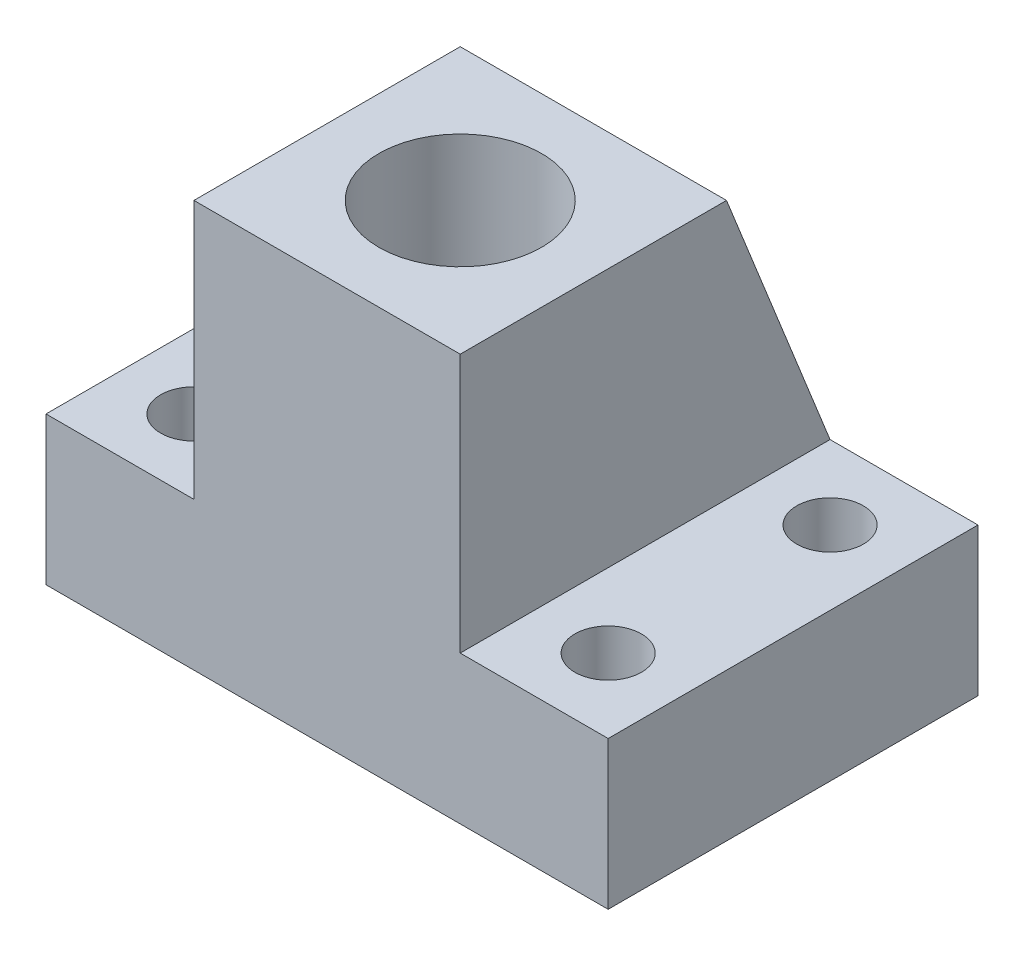
ISO-10303-21;
HEADER;
FILE_DESCRIPTION(('STEP AP214'),'2;1');
FILE_NAME('part.step','',(''),(''),'','','');
FILE_SCHEMA(('AUTOMOTIVE_DESIGN { 1 0 10303 214 1 1 1 1 }'));
ENDSEC;
DATA;
#1=APPLICATION_CONTEXT('core data for automotive mechanical design processes');
#2=APPLICATION_PROTOCOL_DEFINITION('international standard','automotive_design',2000,#1);
#3=PRODUCT_CONTEXT('',#1,'mechanical');
#4=PRODUCT('Part','Part','',(#3));
#5=PRODUCT_RELATED_PRODUCT_CATEGORY('part','',(#4));
#6=PRODUCT_DEFINITION_FORMATION('','',#4);
#7=PRODUCT_DEFINITION_CONTEXT('part definition',#1,'design');
#8=PRODUCT_DEFINITION('design','',#6,#7);
#9=PRODUCT_DEFINITION_SHAPE('','',#8);
#10=(LENGTH_UNIT() NAMED_UNIT(*) SI_UNIT(.MILLI.,.METRE.));
#11=(NAMED_UNIT(*) PLANE_ANGLE_UNIT() SI_UNIT($,.RADIAN.));
#12=(NAMED_UNIT(*) SI_UNIT($,.STERADIAN.) SOLID_ANGLE_UNIT());
#13=UNCERTAINTY_MEASURE_WITH_UNIT(LENGTH_MEASURE(1.E-05),#10,'distance_accuracy_value','');
#14=(GEOMETRIC_REPRESENTATION_CONTEXT(3) GLOBAL_UNCERTAINTY_ASSIGNED_CONTEXT((#13)) GLOBAL_UNIT_ASSIGNED_CONTEXT((#10,
#11,#12)) REPRESENTATION_CONTEXT('',''));
#15=CARTESIAN_POINT('',(0.,0.,0.));
#16=DIRECTION('',(0.,0.,1.));
#17=DIRECTION('',(1.,0.,0.));
#18=AXIS2_PLACEMENT_3D('',#15,#16,#17);
#19=CARTESIAN_POINT('',(38.,20.,-32.));
#20=DIRECTION('',(1.,0.,0.));
#21=DIRECTION('',(0.,0.,-1.));
#22=AXIS2_PLACEMENT_3D('',#19,#20,#21);
#23=PLANE('',#22);
#24=DIRECTION('',(0.,0.,1.));
#25=VECTOR('',#24,1.);
#26=CARTESIAN_POINT('',(38.,20.,-32.));
#27=LINE('',#26,#25);
#28=CARTESIAN_POINT('',(38.,20.,-32.));
#29=VERTEX_POINT('',#28);
#30=CARTESIAN_POINT('',(38.,20.,18.));
#31=VERTEX_POINT('',#30);
#32=EDGE_CURVE('E38',#29,#31,#27,.T.);
#33=ORIENTED_EDGE('',*,*,#32,.T.);
#34=DIRECTION('',(0.,1.,0.));
#35=VECTOR('',#34,1.);
#36=CARTESIAN_POINT('',(38.,20.,18.));
#37=LINE('',#36,#35);
#38=CARTESIAN_POINT('',(38.,0.,18.));
#39=VERTEX_POINT('',#38);
#40=EDGE_CURVE('E251',#39,#31,#37,.T.);
#41=ORIENTED_EDGE('',*,*,#40,.F.);
#42=DIRECTION('',(0.,0.,1.));
#43=VECTOR('',#42,1.);
#44=CARTESIAN_POINT('',(38.,0.,-32.));
#45=LINE('',#44,#43);
#46=CARTESIAN_POINT('',(38.,0.,-32.));
#47=VERTEX_POINT('',#46);
#48=EDGE_CURVE('E11',#47,#39,#45,.T.);
#49=ORIENTED_EDGE('',*,*,#48,.F.);
#50=DIRECTION('',(0.,1.,0.));
#51=VECTOR('',#50,1.);
#52=CARTESIAN_POINT('',(38.,20.,-32.));
#53=LINE('',#52,#51);
#54=EDGE_CURVE('E165',#47,#29,#53,.T.);
#55=ORIENTED_EDGE('',*,*,#54,.T.);
#56=EDGE_LOOP('',(#33,#41,#49,#55));
#57=FACE_BOUND('',#56,.T.);
#58=ADVANCED_FACE('F35',(#57),#23,.T.);
#59=CARTESIAN_POINT('',(38.,0.,-32.));
#60=DIRECTION('',(0.,-1.,0.));
#61=DIRECTION('',(1.,0.,0.));
#62=AXIS2_PLACEMENT_3D('',#59,#60,#61);
#63=PLANE('',#62);
#64=CARTESIAN_POINT('',(28.,0.,8.));
#65=DIRECTION('',(0.,-1.,0.));
#66=DIRECTION('',(1.,0.,0.));
#67=AXIS2_PLACEMENT_3D('',#64,#65,#66);
#68=CIRCLE('',#67,4.5);
#69=CARTESIAN_POINT('',(28.,0.,12.5));
#70=VERTEX_POINT('',#69);
#71=EDGE_CURVE('E223',#70,#70,#68,.F.);
#72=ORIENTED_EDGE('',*,*,#71,.T.);
#73=EDGE_LOOP('',(#72));
#74=FACE_BOUND('',#73,.T.);
#75=CARTESIAN_POINT('',(28.,0.,-22.));
#76=DIRECTION('',(0.,-1.,0.));
#77=DIRECTION('',(1.,0.,0.));
#78=AXIS2_PLACEMENT_3D('',#75,#76,#77);
#79=CIRCLE('',#78,4.50000000000017);
#80=CARTESIAN_POINT('',(28.,0.,-17.4999999999998));
#81=VERTEX_POINT('',#80);
#82=EDGE_CURVE('E215',#81,#81,#79,.F.);
#83=ORIENTED_EDGE('',*,*,#82,.T.);
#84=EDGE_LOOP('',(#83));
#85=FACE_BOUND('',#84,.T.);
#86=CARTESIAN_POINT('',(-28.,0.,8.));
#87=DIRECTION('',(0.,-1.,0.));
#88=DIRECTION('',(1.,0.,0.));
#89=AXIS2_PLACEMENT_3D('',#86,#87,#88);
#90=CIRCLE('',#89,4.5);
#91=CARTESIAN_POINT('',(-28.,0.,12.5));
#92=VERTEX_POINT('',#91);
#93=EDGE_CURVE('E214',#92,#92,#90,.F.);
#94=ORIENTED_EDGE('',*,*,#93,.T.);
#95=EDGE_LOOP('',(#94));
#96=FACE_BOUND('',#95,.T.);
#97=CARTESIAN_POINT('',(-28.,0.,-22.));
#98=DIRECTION('',(0.,-1.,0.));
#99=DIRECTION('',(1.,0.,0.));
#100=AXIS2_PLACEMENT_3D('',#97,#98,#99);
#101=CIRCLE('',#100,4.5);
#102=CARTESIAN_POINT('',(-28.,0.,-17.5));
#103=VERTEX_POINT('',#102);
#104=EDGE_CURVE('E227',#103,#103,#101,.F.);
#105=ORIENTED_EDGE('',*,*,#104,.T.);
#106=EDGE_LOOP('',(#105));
#107=FACE_BOUND('',#106,.T.);
#108=CARTESIAN_POINT('',(0.,0.,0.));
#109=DIRECTION('',(0.,-1.,0.));
#110=DIRECTION('',(1.,0.,0.));
#111=AXIS2_PLACEMENT_3D('',#108,#109,#110);
#112=CIRCLE('',#111,11.);
#113=CARTESIAN_POINT('',(11.,0.,0.));
#114=VERTEX_POINT('',#113);
#115=EDGE_CURVE('E239',#114,#114,#112,.T.);
#116=ORIENTED_EDGE('',*,*,#115,.F.);
#117=EDGE_LOOP('',(#116));
#118=FACE_BOUND('',#117,.T.);
#119=ORIENTED_EDGE('',*,*,#48,.T.);
#120=DIRECTION('',(1.,0.,0.));
#121=VECTOR('',#120,1.);
#122=CARTESIAN_POINT('',(38.,0.,18.));
#123=LINE('',#122,#121);
#124=CARTESIAN_POINT('',(-38.,0.,18.));
#125=VERTEX_POINT('',#124);
#126=EDGE_CURVE('E163',#125,#39,#123,.T.);
#127=ORIENTED_EDGE('',*,*,#126,.F.);
#128=DIRECTION('',(0.,0.,1.));
#129=VECTOR('',#128,1.);
#130=CARTESIAN_POINT('',(-38.,0.,-32.));
#131=LINE('',#130,#129);
#132=CARTESIAN_POINT('',(-38.,0.,-32.));
#133=VERTEX_POINT('',#132);
#134=EDGE_CURVE('E43',#133,#125,#131,.T.);
#135=ORIENTED_EDGE('',*,*,#134,.F.);
#136=DIRECTION('',(1.,0.,0.));
#137=VECTOR('',#136,1.);
#138=CARTESIAN_POINT('',(38.,0.,-32.));
#139=LINE('',#138,#137);
#140=EDGE_CURVE('E137',#133,#47,#139,.T.);
#141=ORIENTED_EDGE('',*,*,#140,.T.);
#142=EDGE_LOOP('',(#119,#127,#135,#141));
#143=FACE_BOUND('',#142,.T.);
#144=ADVANCED_FACE('F176',(#74,#85,#96,#107,#118,#143),#63,.T.);
#145=CARTESIAN_POINT('',(-38.,0.,-32.));
#146=DIRECTION('',(-1.,0.,0.));
#147=DIRECTION('',(0.,-1.,0.));
#148=AXIS2_PLACEMENT_3D('',#145,#146,#147);
#149=PLANE('',#148);
#150=ORIENTED_EDGE('',*,*,#134,.T.);
#151=DIRECTION('',(0.,-1.,0.));
#152=VECTOR('',#151,1.);
#153=CARTESIAN_POINT('',(-38.,0.,18.));
#154=LINE('',#153,#152);
#155=CARTESIAN_POINT('',(-38.,20.,18.));
#156=VERTEX_POINT('',#155);
#157=EDGE_CURVE('E160',#156,#125,#154,.T.);
#158=ORIENTED_EDGE('',*,*,#157,.F.);
#159=DIRECTION('',(0.,0.,1.));
#160=VECTOR('',#159,1.);
#161=CARTESIAN_POINT('',(-38.,20.,-32.));
#162=LINE('',#161,#160);
#163=CARTESIAN_POINT('',(-38.,20.,-32.));
#164=VERTEX_POINT('',#163);
#165=EDGE_CURVE('E127',#164,#156,#162,.T.);
#166=ORIENTED_EDGE('',*,*,#165,.F.);
#167=DIRECTION('',(0.,-1.,0.));
#168=VECTOR('',#167,1.);
#169=CARTESIAN_POINT('',(-38.,0.,-32.));
#170=LINE('',#169,#168);
#171=EDGE_CURVE('E138',#164,#133,#170,.T.);
#172=ORIENTED_EDGE('',*,*,#171,.T.);
#173=EDGE_LOOP('',(#150,#158,#166,#172));
#174=FACE_BOUND('',#173,.T.);
#175=ADVANCED_FACE('F162',(#174),#149,.T.);
#176=CARTESIAN_POINT('',(-38.,20.,-32.));
#177=DIRECTION('',(0.,1.,0.));
#178=DIRECTION('',(0.,0.,1.));
#179=AXIS2_PLACEMENT_3D('',#176,#177,#178);
#180=PLANE('',#179);
#181=CARTESIAN_POINT('',(-28.,20.,8.));
#182=DIRECTION('',(0.,1.,0.));
#183=DIRECTION('',(0.,0.,1.));
#184=AXIS2_PLACEMENT_3D('',#181,#182,#183);
#185=CIRCLE('',#184,4.5);
#186=CARTESIAN_POINT('',(-28.,20.,12.5));
#187=VERTEX_POINT('',#186);
#188=EDGE_CURVE('E218',#187,#187,#185,.T.);
#189=ORIENTED_EDGE('',*,*,#188,.F.);
#190=EDGE_LOOP('',(#189));
#191=FACE_BOUND('',#190,.T.);
#192=CARTESIAN_POINT('',(-28.,20.,-22.));
#193=DIRECTION('',(0.,1.,0.));
#194=DIRECTION('',(0.,0.,1.));
#195=AXIS2_PLACEMENT_3D('',#192,#193,#194);
#196=CIRCLE('',#195,4.5);
#197=CARTESIAN_POINT('',(-28.,20.,-17.5));
#198=VERTEX_POINT('',#197);
#199=EDGE_CURVE('E229',#198,#198,#196,.T.);
#200=ORIENTED_EDGE('',*,*,#199,.F.);
#201=EDGE_LOOP('',(#200));
#202=FACE_BOUND('',#201,.T.);
#203=ORIENTED_EDGE('',*,*,#165,.T.);
#204=DIRECTION('',(-1.,0.,0.));
#205=VECTOR('',#204,1.);
#206=CARTESIAN_POINT('',(-38.,20.,18.));
#207=LINE('',#206,#205);
#208=CARTESIAN_POINT('',(-18.,20.,18.));
#209=VERTEX_POINT('',#208);
#210=EDGE_CURVE('E150',#209,#156,#207,.T.);
#211=ORIENTED_EDGE('',*,*,#210,.F.);
#212=DIRECTION('',(0.,0.,1.));
#213=VECTOR('',#212,1.);
#214=CARTESIAN_POINT('',(-18.,20.,-32.));
#215=LINE('',#214,#213);
#216=CARTESIAN_POINT('',(-18.,20.,-32.));
#217=VERTEX_POINT('',#216);
#218=EDGE_CURVE('E125',#217,#209,#215,.T.);
#219=ORIENTED_EDGE('',*,*,#218,.F.);
#220=DIRECTION('',(-1.,0.,0.));
#221=VECTOR('',#220,1.);
#222=CARTESIAN_POINT('',(-38.,20.,-32.));
#223=LINE('',#222,#221);
#224=EDGE_CURVE('E141',#217,#164,#223,.T.);
#225=ORIENTED_EDGE('',*,*,#224,.T.);
#226=EDGE_LOOP('',(#203,#211,#219,#225));
#227=FACE_BOUND('',#226,.T.);
#228=ADVANCED_FACE('F149',(#191,#202,#227),#180,.T.);
#229=CARTESIAN_POINT('',(-18.,20.,-32.));
#230=DIRECTION('',(-1.,0.,0.));
#231=DIRECTION('',(0.,0.,1.));
#232=AXIS2_PLACEMENT_3D('',#229,#230,#231);
#233=PLANE('',#232);
#234=DIRECTION('',(0.,-0.928476690885259,-0.371390676354104));
#235=VECTOR('',#234,1.);
#236=CARTESIAN_POINT('',(-18.,55.,-18.));
#237=LINE('',#236,#235);
#238=CARTESIAN_POINT('',(-18.,55.,-18.));
#239=VERTEX_POINT('',#238);
#240=EDGE_CURVE('E99',#239,#217,#237,.T.);
#241=ORIENTED_EDGE('',*,*,#240,.T.);
#242=ORIENTED_EDGE('',*,*,#218,.T.);
#243=DIRECTION('',(0.,-1.,0.));
#244=VECTOR('',#243,1.);
#245=CARTESIAN_POINT('',(-18.,20.,18.));
#246=LINE('',#245,#244);
#247=CARTESIAN_POINT('',(-18.,55.,18.));
#248=VERTEX_POINT('',#247);
#249=EDGE_CURVE('E124',#248,#209,#246,.T.);
#250=ORIENTED_EDGE('',*,*,#249,.F.);
#251=DIRECTION('',(0.,0.,1.));
#252=VECTOR('',#251,1.);
#253=CARTESIAN_POINT('',(-18.,55.,-32.));
#254=LINE('',#253,#252);
#255=EDGE_CURVE('E116',#239,#248,#254,.T.);
#256=ORIENTED_EDGE('',*,*,#255,.F.);
#257=EDGE_LOOP('',(#241,#242,#250,#256));
#258=FACE_BOUND('',#257,.T.);
#259=ADVANCED_FACE('F122',(#258),#233,.T.);
#260=CARTESIAN_POINT('',(-18.,55.,-32.));
#261=DIRECTION('',(0.,1.,0.));
#262=DIRECTION('',(0.,0.,1.));
#263=AXIS2_PLACEMENT_3D('',#260,#261,#262);
#264=PLANE('',#263);
#265=DIRECTION('',(1.,0.,0.));
#266=VECTOR('',#265,1.);
#267=CARTESIAN_POINT('',(-38.001,55.,-18.));
#268=LINE('',#267,#266);
#269=CARTESIAN_POINT('',(18.,55.,-18.));
#270=VERTEX_POINT('',#269);
#271=EDGE_CURVE('E102',#239,#270,#268,.T.);
#272=ORIENTED_EDGE('',*,*,#271,.F.);
#273=ORIENTED_EDGE('',*,*,#255,.T.);
#274=DIRECTION('',(-1.,0.,0.));
#275=VECTOR('',#274,1.);
#276=CARTESIAN_POINT('',(-18.,55.,18.));
#277=LINE('',#276,#275);
#278=CARTESIAN_POINT('',(18.,55.,18.));
#279=VERTEX_POINT('',#278);
#280=EDGE_CURVE('E260',#279,#248,#277,.T.);
#281=ORIENTED_EDGE('',*,*,#280,.F.);
#282=DIRECTION('',(0.,0.,1.));
#283=VECTOR('',#282,1.);
#284=CARTESIAN_POINT('',(18.,55.,-32.));
#285=LINE('',#284,#283);
#286=EDGE_CURVE('E118',#270,#279,#285,.T.);
#287=ORIENTED_EDGE('',*,*,#286,.F.);
#288=EDGE_LOOP('',(#272,#273,#281,#287));
#289=FACE_BOUND('',#288,.T.);
#290=CARTESIAN_POINT('',(0.,55.,0.));
#291=DIRECTION('',(0.,1.,0.));
#292=DIRECTION('',(0.,0.,1.));
#293=AXIS2_PLACEMENT_3D('',#290,#291,#292);
#294=CIRCLE('',#293,11.);
#295=CARTESIAN_POINT('',(0.,55.,11.));
#296=VERTEX_POINT('',#295);
#297=EDGE_CURVE('E245',#296,#296,#294,.T.);
#298=ORIENTED_EDGE('',*,*,#297,.F.);
#299=EDGE_LOOP('',(#298));
#300=FACE_BOUND('',#299,.T.);
#301=ADVANCED_FACE('F113',(#289,#300),#264,.T.);
#302=CARTESIAN_POINT('',(18.,55.,-32.));
#303=DIRECTION('',(1.,0.,0.));
#304=DIRECTION('',(0.,1.,0.));
#305=AXIS2_PLACEMENT_3D('',#302,#303,#304);
#306=PLANE('',#305);
#307=DIRECTION('',(0.,-0.928476690885259,-0.371390676354104));
#308=VECTOR('',#307,1.);
#309=CARTESIAN_POINT('',(18.,55.,-18.));
#310=LINE('',#309,#308);
#311=CARTESIAN_POINT('',(18.,20.,-32.));
#312=VERTEX_POINT('',#311);
#313=EDGE_CURVE('E119',#270,#312,#310,.T.);
#314=ORIENTED_EDGE('',*,*,#313,.F.);
#315=ORIENTED_EDGE('',*,*,#286,.T.);
#316=DIRECTION('',(0.,1.,0.));
#317=VECTOR('',#316,1.);
#318=CARTESIAN_POINT('',(18.,55.,18.));
#319=LINE('',#318,#317);
#320=CARTESIAN_POINT('',(18.,20.,18.));
#321=VERTEX_POINT('',#320);
#322=EDGE_CURVE('E257',#321,#279,#319,.T.);
#323=ORIENTED_EDGE('',*,*,#322,.F.);
#324=DIRECTION('',(0.,0.,1.));
#325=VECTOR('',#324,1.);
#326=CARTESIAN_POINT('',(18.,20.,-32.));
#327=LINE('',#326,#325);
#328=EDGE_CURVE('E129',#312,#321,#327,.T.);
#329=ORIENTED_EDGE('',*,*,#328,.F.);
#330=EDGE_LOOP('',(#314,#315,#323,#329));
#331=FACE_BOUND('',#330,.T.);
#332=ADVANCED_FACE('F198',(#331),#306,.T.);
#333=CARTESIAN_POINT('',(18.,20.,-32.));
#334=DIRECTION('',(0.,1.,0.));
#335=DIRECTION('',(0.,0.,1.));
#336=AXIS2_PLACEMENT_3D('',#333,#334,#335);
#337=PLANE('',#336);
#338=CARTESIAN_POINT('',(28.,20.,8.));
#339=DIRECTION('',(0.,1.,0.));
#340=DIRECTION('',(0.,0.,1.));
#341=AXIS2_PLACEMENT_3D('',#338,#339,#340);
#342=CIRCLE('',#341,4.5);
#343=CARTESIAN_POINT('',(28.,20.,12.5));
#344=VERTEX_POINT('',#343);
#345=EDGE_CURVE('E209',#344,#344,#342,.T.);
#346=ORIENTED_EDGE('',*,*,#345,.F.);
#347=EDGE_LOOP('',(#346));
#348=FACE_BOUND('',#347,.T.);
#349=CARTESIAN_POINT('',(28.,20.,-22.));
#350=DIRECTION('',(0.,1.,0.));
#351=DIRECTION('',(0.,0.,1.));
#352=AXIS2_PLACEMENT_3D('',#349,#350,#351);
#353=CIRCLE('',#352,4.50000000000017);
#354=CARTESIAN_POINT('',(28.,20.,-17.4999999999998));
#355=VERTEX_POINT('',#354);
#356=EDGE_CURVE('E212',#355,#355,#353,.T.);
#357=ORIENTED_EDGE('',*,*,#356,.F.);
#358=EDGE_LOOP('',(#357));
#359=FACE_BOUND('',#358,.T.);
#360=ORIENTED_EDGE('',*,*,#328,.T.);
#361=DIRECTION('',(-1.,0.,0.));
#362=VECTOR('',#361,1.);
#363=CARTESIAN_POINT('',(18.,20.,18.));
#364=LINE('',#363,#362);
#365=EDGE_CURVE('E255',#31,#321,#364,.T.);
#366=ORIENTED_EDGE('',*,*,#365,.F.);
#367=ORIENTED_EDGE('',*,*,#32,.F.);
#368=DIRECTION('',(-1.,0.,0.));
#369=VECTOR('',#368,1.);
#370=CARTESIAN_POINT('',(18.,20.,-32.));
#371=LINE('',#370,#369);
#372=EDGE_CURVE('E170',#29,#312,#371,.T.);
#373=ORIENTED_EDGE('',*,*,#372,.T.);
#374=EDGE_LOOP('',(#360,#366,#367,#373));
#375=FACE_BOUND('',#374,.T.);
#376=ADVANCED_FACE('F172',(#348,#359,#375),#337,.T.);
#377=CARTESIAN_POINT('',(0.,0.,-32.));
#378=DIRECTION('',(0.,0.,-1.));
#379=DIRECTION('',(-1.,0.,0.));
#380=AXIS2_PLACEMENT_3D('',#377,#378,#379);
#381=PLANE('',#380);
#382=DIRECTION('',(1.,0.,0.));
#383=VECTOR('',#382,1.);
#384=CARTESIAN_POINT('',(-38.001,20.,-32.));
#385=LINE('',#384,#383);
#386=EDGE_CURVE('E105',#217,#312,#385,.T.);
#387=ORIENTED_EDGE('',*,*,#386,.T.);
#388=ORIENTED_EDGE('',*,*,#372,.F.);
#389=ORIENTED_EDGE('',*,*,#54,.F.);
#390=ORIENTED_EDGE('',*,*,#140,.F.);
#391=ORIENTED_EDGE('',*,*,#171,.F.);
#392=ORIENTED_EDGE('',*,*,#224,.F.);
#393=EDGE_LOOP('',(#387,#388,#389,#390,#391,#392));
#394=FACE_BOUND('',#393,.T.);
#395=ADVANCED_FACE('F174',(#394),#381,.T.);
#396=CARTESIAN_POINT('',(0.,0.,18.));
#397=DIRECTION('',(0.,0.,-1.));
#398=DIRECTION('',(-1.,0.,0.));
#399=AXIS2_PLACEMENT_3D('',#396,#397,#398);
#400=PLANE('',#399);
#401=ORIENTED_EDGE('',*,*,#40,.T.);
#402=ORIENTED_EDGE('',*,*,#365,.T.);
#403=ORIENTED_EDGE('',*,*,#322,.T.);
#404=ORIENTED_EDGE('',*,*,#280,.T.);
#405=ORIENTED_EDGE('',*,*,#249,.T.);
#406=ORIENTED_EDGE('',*,*,#210,.T.);
#407=ORIENTED_EDGE('',*,*,#157,.T.);
#408=ORIENTED_EDGE('',*,*,#126,.T.);
#409=EDGE_LOOP('',(#401,#402,#403,#404,#405,#406,#407,#408));
#410=FACE_BOUND('',#409,.T.);
#411=ADVANCED_FACE('F158',(#410),#400,.F.);
#412=CARTESIAN_POINT('',(0.,25.,0.));
#413=DIRECTION('',(0.,1.,0.));
#414=DIRECTION('',(0.,0.,1.));
#415=AXIS2_PLACEMENT_3D('',#412,#413,#414);
#416=CYLINDRICAL_SURFACE('',#415,11.);
#417=CARTESIAN_POINT('',(0.,25.,0.));
#418=DIRECTION('',(0.,1.,0.));
#419=DIRECTION('',(0.,0.,1.));
#420=AXIS2_PLACEMENT_3D('',#417,#418,#419);
#421=CIRCLE('',#420,11.);
#422=CARTESIAN_POINT('',(0.,25.,11.));
#423=VERTEX_POINT('',#422);
#424=EDGE_CURVE('E248',#423,#423,#421,.T.);
#425=ORIENTED_EDGE('',*,*,#424,.F.);
#426=EDGE_LOOP('',(#425));
#427=FACE_BOUND('',#426,.T.);
#428=ORIENTED_EDGE('',*,*,#297,.T.);
#429=EDGE_LOOP('',(#428));
#430=FACE_BOUND('',#429,.T.);
#431=ADVANCED_FACE('F264',(#427,#430),#416,.F.);
#432=CARTESIAN_POINT('',(0.,25.,0.));
#433=DIRECTION('',(0.,1.,0.));
#434=DIRECTION('',(0.,0.,1.));
#435=AXIS2_PLACEMENT_3D('',#432,#433,#434);
#436=PLANE('',#435);
#437=CARTESIAN_POINT('',(0.,25.,0.));
#438=DIRECTION('',(0.,1.,0.));
#439=DIRECTION('',(0.,0.,1.));
#440=AXIS2_PLACEMENT_3D('',#437,#438,#439);
#441=CIRCLE('',#440,5.5);
#442=CARTESIAN_POINT('',(0.,25.,5.5));
#443=VERTEX_POINT('',#442);
#444=EDGE_CURVE('E236',#443,#443,#441,.T.);
#445=ORIENTED_EDGE('',*,*,#444,.F.);
#446=EDGE_LOOP('',(#445));
#447=FACE_BOUND('',#446,.T.);
#448=ORIENTED_EDGE('',*,*,#424,.T.);
#449=EDGE_LOOP('',(#448));
#450=FACE_BOUND('',#449,.T.);
#451=ADVANCED_FACE('F266',(#447,#450),#436,.T.);
#452=CARTESIAN_POINT('',(0.,16.,0.));
#453=DIRECTION('',(0.,-1.,0.));
#454=DIRECTION('',(1.,0.,0.));
#455=AXIS2_PLACEMENT_3D('',#452,#453,#454);
#456=CYLINDRICAL_SURFACE('',#455,11.);
#457=CARTESIAN_POINT('',(0.,16.,0.));
#458=DIRECTION('',(0.,-1.,0.));
#459=DIRECTION('',(1.,0.,0.));
#460=AXIS2_PLACEMENT_3D('',#457,#458,#459);
#461=CIRCLE('',#460,11.);
#462=CARTESIAN_POINT('',(11.,16.,0.));
#463=VERTEX_POINT('',#462);
#464=EDGE_CURVE('E242',#463,#463,#461,.T.);
#465=ORIENTED_EDGE('',*,*,#464,.F.);
#466=EDGE_LOOP('',(#465));
#467=FACE_BOUND('',#466,.T.);
#468=ORIENTED_EDGE('',*,*,#115,.T.);
#469=EDGE_LOOP('',(#468));
#470=FACE_BOUND('',#469,.T.);
#471=ADVANCED_FACE('F273',(#467,#470),#456,.F.);
#472=CARTESIAN_POINT('',(0.,16.,0.));
#473=DIRECTION('',(0.,-1.,0.));
#474=DIRECTION('',(1.,0.,0.));
#475=AXIS2_PLACEMENT_3D('',#472,#473,#474);
#476=PLANE('',#475);
#477=CARTESIAN_POINT('',(0.,16.,0.));
#478=DIRECTION('',(0.,-1.,0.));
#479=DIRECTION('',(1.,0.,0.));
#480=AXIS2_PLACEMENT_3D('',#477,#478,#479);
#481=CIRCLE('',#480,5.5);
#482=CARTESIAN_POINT('',(5.5,16.,0.));
#483=VERTEX_POINT('',#482);
#484=EDGE_CURVE('E109',#483,#483,#481,.F.);
#485=ORIENTED_EDGE('',*,*,#484,.T.);
#486=EDGE_LOOP('',(#485));
#487=FACE_BOUND('',#486,.T.);
#488=ORIENTED_EDGE('',*,*,#464,.T.);
#489=EDGE_LOOP('',(#488));
#490=FACE_BOUND('',#489,.T.);
#491=ADVANCED_FACE('F280',(#487,#490),#476,.T.);
#492=CARTESIAN_POINT('',(0.,-0.00100000000000794,0.));
#493=DIRECTION('',(0.,1.,0.));
#494=DIRECTION('',(0.,0.,1.));
#495=AXIS2_PLACEMENT_3D('',#492,#493,#494);
#496=CYLINDRICAL_SURFACE('',#495,5.5);
#497=ORIENTED_EDGE('',*,*,#484,.F.);
#498=EDGE_LOOP('',(#497));
#499=FACE_BOUND('',#498,.T.);
#500=ORIENTED_EDGE('',*,*,#444,.T.);
#501=EDGE_LOOP('',(#500));
#502=FACE_BOUND('',#501,.T.);
#503=ADVANCED_FACE('F284',(#499,#502),#496,.F.);
#504=CARTESIAN_POINT('',(-38.001,55.,-18.));
#505=DIRECTION('',(0.,-0.371390676354104,0.928476690885259));
#506=DIRECTION('',(0.,-0.928476690885259,-0.371390676354104));
#507=AXIS2_PLACEMENT_3D('',#504,#505,#506);
#508=PLANE('',#507);
#509=ORIENTED_EDGE('',*,*,#271,.T.);
#510=ORIENTED_EDGE('',*,*,#313,.T.);
#511=ORIENTED_EDGE('',*,*,#386,.F.);
#512=ORIENTED_EDGE('',*,*,#240,.F.);
#513=EDGE_LOOP('',(#509,#510,#511,#512));
#514=FACE_BOUND('',#513,.T.);
#515=ADVANCED_FACE('F101',(#514),#508,.F.);
#516=CARTESIAN_POINT('',(-28.,-0.00100000000000794,-22.));
#517=DIRECTION('',(0.,1.,0.));
#518=DIRECTION('',(0.,0.,1.));
#519=AXIS2_PLACEMENT_3D('',#516,#517,#518);
#520=CYLINDRICAL_SURFACE('',#519,4.5);
#521=CARTESIAN_POINT('',(-28.,0.,-17.5));
#522=CARTESIAN_POINT('',(-28.,0.208333333333326,-17.5));
#523=CARTESIAN_POINT('',(-28.,0.416666666666659,-17.5));
#524=CARTESIAN_POINT('',(-28.,0.833333333333325,-17.5));
#525=CARTESIAN_POINT('',(-28.,1.04166666666666,-17.5));
#526=CARTESIAN_POINT('',(-28.,1.45833333333333,-17.5));
#527=CARTESIAN_POINT('',(-28.,1.66666666666666,-17.5));
#528=CARTESIAN_POINT('',(-28.,2.08333333333333,-17.5));
#529=CARTESIAN_POINT('',(-28.,2.29166666666666,-17.5));
#530=CARTESIAN_POINT('',(-28.,2.70833333333333,-17.5));
#531=CARTESIAN_POINT('',(-28.,2.91666666666666,-17.5));
#532=CARTESIAN_POINT('',(-28.,3.33333333333333,-17.5));
#533=CARTESIAN_POINT('',(-28.,3.54166666666666,-17.5));
#534=CARTESIAN_POINT('',(-28.,3.95833333333333,-17.5));
#535=CARTESIAN_POINT('',(-28.,4.16666666666666,-17.5));
#536=CARTESIAN_POINT('',(-28.,4.58333333333333,-17.5));
#537=CARTESIAN_POINT('',(-28.,4.79166666666666,-17.5));
#538=CARTESIAN_POINT('',(-28.,5.20833333333333,-17.5));
#539=CARTESIAN_POINT('',(-28.,5.41666666666666,-17.5));
#540=CARTESIAN_POINT('',(-28.,5.83333333333333,-17.5));
#541=CARTESIAN_POINT('',(-28.,6.04166666666666,-17.5));
#542=CARTESIAN_POINT('',(-28.,6.45833333333333,-17.5));
#543=CARTESIAN_POINT('',(-28.,6.66666666666666,-17.5));
#544=CARTESIAN_POINT('',(-28.,7.08333333333333,-17.5));
#545=CARTESIAN_POINT('',(-28.,7.29166666666666,-17.5));
#546=CARTESIAN_POINT('',(-28.,7.70833333333333,-17.5));
#547=CARTESIAN_POINT('',(-28.,7.91666666666666,-17.5));
#548=CARTESIAN_POINT('',(-28.,8.33333333333333,-17.5));
#549=CARTESIAN_POINT('',(-28.,8.54166666666666,-17.5));
#550=CARTESIAN_POINT('',(-28.,8.95833333333332,-17.5));
#551=CARTESIAN_POINT('',(-28.,9.16666666666666,-17.5));
#552=CARTESIAN_POINT('',(-28.,9.58333333333332,-17.5));
#553=CARTESIAN_POINT('',(-28.,9.79166666666666,-17.5));
#554=CARTESIAN_POINT('',(-28.,10.2083333333333,-17.5));
#555=CARTESIAN_POINT('',(-28.,10.4166666666667,-17.5));
#556=CARTESIAN_POINT('',(-28.,10.8333333333333,-17.5));
#557=CARTESIAN_POINT('',(-28.,11.0416666666667,-17.5));
#558=CARTESIAN_POINT('',(-28.,11.4583333333333,-17.5));
#559=CARTESIAN_POINT('',(-28.,11.6666666666667,-17.5));
#560=CARTESIAN_POINT('',(-28.,12.0833333333333,-17.5));
#561=CARTESIAN_POINT('',(-28.,12.2916666666667,-17.5));
#562=CARTESIAN_POINT('',(-28.,12.7083333333333,-17.5));
#563=CARTESIAN_POINT('',(-28.,12.9166666666667,-17.5));
#564=CARTESIAN_POINT('',(-28.,13.3333333333333,-17.5));
#565=CARTESIAN_POINT('',(-28.,13.5416666666667,-17.5));
#566=CARTESIAN_POINT('',(-28.,13.9583333333333,-17.5));
#567=CARTESIAN_POINT('',(-28.,14.1666666666667,-17.5));
#568=CARTESIAN_POINT('',(-28.,14.5833333333333,-17.5));
#569=CARTESIAN_POINT('',(-28.,14.7916666666667,-17.5));
#570=CARTESIAN_POINT('',(-28.,15.2083333333333,-17.5));
#571=CARTESIAN_POINT('',(-28.,15.4166666666667,-17.5));
#572=CARTESIAN_POINT('',(-28.,15.8333333333333,-17.5));
#573=CARTESIAN_POINT('',(-28.,16.0416666666667,-17.5));
#574=CARTESIAN_POINT('',(-28.,16.4583333333333,-17.5));
#575=CARTESIAN_POINT('',(-28.,16.6666666666667,-17.5));
#576=CARTESIAN_POINT('',(-28.,17.0833333333333,-17.5));
#577=CARTESIAN_POINT('',(-28.,17.2916666666667,-17.5));
#578=CARTESIAN_POINT('',(-28.,17.7083333333333,-17.5));
#579=CARTESIAN_POINT('',(-28.,17.9166666666667,-17.5));
#580=CARTESIAN_POINT('',(-28.,18.3333333333333,-17.5));
#581=CARTESIAN_POINT('',(-28.,18.5416666666667,-17.5));
#582=CARTESIAN_POINT('',(-28.,18.9583333333333,-17.5));
#583=CARTESIAN_POINT('',(-28.,19.1666666666667,-17.5));
#584=CARTESIAN_POINT('',(-28.,19.5833333333333,-17.5));
#585=CARTESIAN_POINT('',(-28.,19.7916666666667,-17.5));
#586=CARTESIAN_POINT('',(-28.,20.,-17.5));
#587=B_SPLINE_CURVE_WITH_KNOTS('',3,(#521,#522,#523,#524,#525,#526,#527,#528,#529,#530,#531,
#532,#533,#534,#535,#536,#537,#538,#539,#540,#541,#542,#543,#544,#545,#546,#547,#548,#549,#550,
#551,#552,#553,#554,#555,#556,#557,#558,#559,#560,#561,#562,#563,#564,#565,#566,#567,#568,#569,
#570,#571,#572,#573,#574,#575,#576,#577,#578,#579,#580,#581,#582,#583,#584,#585,#586),
.UNSPECIFIED.,.F.,.F.,(4,2,2,2,2,2,2,2,2,2,2,2,2,2,2,2,2,2,2,2,2,2,2,2,2,2,2,2,2,2,2,2,4),(0.,
0.625,1.25,1.875,2.5,3.125,3.75,4.375,5.,5.625,6.25,6.875,7.5,8.125,8.75,9.375,10.,10.625,11.25,
11.875,12.5,13.125,13.75,14.375,15.,15.625,16.25,16.875,17.5,18.125,18.75,19.375,20.),.UNSPECIFIED.);
#588=EDGE_CURVE('BSEAM291',#103,#198,#587,.T.);
#589=ORIENTED_EDGE('',*,*,#104,.F.);
#590=ORIENTED_EDGE('',*,*,#199,.T.);
#591=ORIENTED_EDGE('',*,*,#588,.T.);
#592=ORIENTED_EDGE('',*,*,#588,.F.);
#593=EDGE_LOOP('',(#589,#591,#590,#592));
#594=FACE_BOUND('',#593,.T.);
#595=ADVANCED_FACE('F291',(#594),#520,.F.);
#596=CARTESIAN_POINT('',(-28.,-0.00100000000000794,8.));
#597=DIRECTION('',(0.,1.,0.));
#598=DIRECTION('',(0.,0.,1.));
#599=AXIS2_PLACEMENT_3D('',#596,#597,#598);
#600=CYLINDRICAL_SURFACE('',#599,4.5);
#601=CARTESIAN_POINT('',(-28.,0.,12.5));
#602=CARTESIAN_POINT('',(-28.,0.208333333333326,12.5));
#603=CARTESIAN_POINT('',(-28.,0.416666666666659,12.5));
#604=CARTESIAN_POINT('',(-28.,0.833333333333325,12.5));
#605=CARTESIAN_POINT('',(-28.,1.04166666666666,12.5));
#606=CARTESIAN_POINT('',(-28.,1.45833333333333,12.5));
#607=CARTESIAN_POINT('',(-28.,1.66666666666666,12.5));
#608=CARTESIAN_POINT('',(-28.,2.08333333333333,12.5));
#609=CARTESIAN_POINT('',(-28.,2.29166666666666,12.5));
#610=CARTESIAN_POINT('',(-28.,2.70833333333333,12.5));
#611=CARTESIAN_POINT('',(-28.,2.91666666666666,12.5));
#612=CARTESIAN_POINT('',(-28.,3.33333333333333,12.5));
#613=CARTESIAN_POINT('',(-28.,3.54166666666666,12.5));
#614=CARTESIAN_POINT('',(-28.,3.95833333333333,12.5));
#615=CARTESIAN_POINT('',(-28.,4.16666666666666,12.5));
#616=CARTESIAN_POINT('',(-28.,4.58333333333333,12.5));
#617=CARTESIAN_POINT('',(-28.,4.79166666666666,12.5));
#618=CARTESIAN_POINT('',(-28.,5.20833333333333,12.5));
#619=CARTESIAN_POINT('',(-28.,5.41666666666666,12.5));
#620=CARTESIAN_POINT('',(-28.,5.83333333333333,12.5));
#621=CARTESIAN_POINT('',(-28.,6.04166666666666,12.5));
#622=CARTESIAN_POINT('',(-28.,6.45833333333333,12.5));
#623=CARTESIAN_POINT('',(-28.,6.66666666666666,12.5));
#624=CARTESIAN_POINT('',(-28.,7.08333333333333,12.5));
#625=CARTESIAN_POINT('',(-28.,7.29166666666666,12.5));
#626=CARTESIAN_POINT('',(-28.,7.70833333333333,12.5));
#627=CARTESIAN_POINT('',(-28.,7.91666666666666,12.5));
#628=CARTESIAN_POINT('',(-28.,8.33333333333333,12.5));
#629=CARTESIAN_POINT('',(-28.,8.54166666666666,12.5));
#630=CARTESIAN_POINT('',(-28.,8.95833333333332,12.5));
#631=CARTESIAN_POINT('',(-28.,9.16666666666666,12.5));
#632=CARTESIAN_POINT('',(-28.,9.58333333333332,12.5));
#633=CARTESIAN_POINT('',(-28.,9.79166666666666,12.5));
#634=CARTESIAN_POINT('',(-28.,10.2083333333333,12.5));
#635=CARTESIAN_POINT('',(-28.,10.4166666666667,12.5));
#636=CARTESIAN_POINT('',(-28.,10.8333333333333,12.5));
#637=CARTESIAN_POINT('',(-28.,11.0416666666667,12.5));
#638=CARTESIAN_POINT('',(-28.,11.4583333333333,12.5));
#639=CARTESIAN_POINT('',(-28.,11.6666666666667,12.5));
#640=CARTESIAN_POINT('',(-28.,12.0833333333333,12.5));
#641=CARTESIAN_POINT('',(-28.,12.2916666666667,12.5));
#642=CARTESIAN_POINT('',(-28.,12.7083333333333,12.5));
#643=CARTESIAN_POINT('',(-28.,12.9166666666667,12.5));
#644=CARTESIAN_POINT('',(-28.,13.3333333333333,12.5));
#645=CARTESIAN_POINT('',(-28.,13.5416666666667,12.5));
#646=CARTESIAN_POINT('',(-28.,13.9583333333333,12.5));
#647=CARTESIAN_POINT('',(-28.,14.1666666666667,12.5));
#648=CARTESIAN_POINT('',(-28.,14.5833333333333,12.5));
#649=CARTESIAN_POINT('',(-28.,14.7916666666667,12.5));
#650=CARTESIAN_POINT('',(-28.,15.2083333333333,12.5));
#651=CARTESIAN_POINT('',(-28.,15.4166666666667,12.5));
#652=CARTESIAN_POINT('',(-28.,15.8333333333333,12.5));
#653=CARTESIAN_POINT('',(-28.,16.0416666666667,12.5));
#654=CARTESIAN_POINT('',(-28.,16.4583333333333,12.5));
#655=CARTESIAN_POINT('',(-28.,16.6666666666667,12.5));
#656=CARTESIAN_POINT('',(-28.,17.0833333333333,12.5));
#657=CARTESIAN_POINT('',(-28.,17.2916666666667,12.5));
#658=CARTESIAN_POINT('',(-28.,17.7083333333333,12.5));
#659=CARTESIAN_POINT('',(-28.,17.9166666666667,12.5));
#660=CARTESIAN_POINT('',(-28.,18.3333333333333,12.5));
#661=CARTESIAN_POINT('',(-28.,18.5416666666667,12.5));
#662=CARTESIAN_POINT('',(-28.,18.9583333333333,12.5));
#663=CARTESIAN_POINT('',(-28.,19.1666666666667,12.5));
#664=CARTESIAN_POINT('',(-28.,19.5833333333333,12.5));
#665=CARTESIAN_POINT('',(-28.,19.7916666666667,12.5));
#666=CARTESIAN_POINT('',(-28.,20.,12.5));
#667=B_SPLINE_CURVE_WITH_KNOTS('',3,(#601,#602,#603,#604,#605,#606,#607,#608,#609,#610,#611,
#612,#613,#614,#615,#616,#617,#618,#619,#620,#621,#622,#623,#624,#625,#626,#627,#628,#629,#630,
#631,#632,#633,#634,#635,#636,#637,#638,#639,#640,#641,#642,#643,#644,#645,#646,#647,#648,#649,
#650,#651,#652,#653,#654,#655,#656,#657,#658,#659,#660,#661,#662,#663,#664,#665,#666),
.UNSPECIFIED.,.F.,.F.,(4,2,2,2,2,2,2,2,2,2,2,2,2,2,2,2,2,2,2,2,2,2,2,2,2,2,2,2,2,2,2,2,4),(0.,
0.625,1.25,1.875,2.5,3.125,3.75,4.375,5.,5.625,6.25,6.875,7.5,8.125,8.75,9.375,10.,10.625,11.25,
11.875,12.5,13.125,13.75,14.375,15.,15.625,16.25,16.875,17.5,18.125,18.75,19.375,20.),.UNSPECIFIED.);
#668=EDGE_CURVE('BSEAM294',#92,#187,#667,.T.);
#669=ORIENTED_EDGE('',*,*,#93,.F.);
#670=ORIENTED_EDGE('',*,*,#188,.T.);
#671=ORIENTED_EDGE('',*,*,#668,.T.);
#672=ORIENTED_EDGE('',*,*,#668,.F.);
#673=EDGE_LOOP('',(#669,#671,#670,#672));
#674=FACE_BOUND('',#673,.T.);
#675=ADVANCED_FACE('F294',(#674),#600,.F.);
#676=CARTESIAN_POINT('',(28.,-0.00100000000000794,-22.));
#677=DIRECTION('',(0.,1.,0.));
#678=DIRECTION('',(0.,0.,1.));
#679=AXIS2_PLACEMENT_3D('',#676,#677,#678);
#680=CYLINDRICAL_SURFACE('',#679,4.50000000000017);
#681=CARTESIAN_POINT('',(28.,0.,-17.4999999999998));
#682=CARTESIAN_POINT('',(28.,0.208333333333332,-17.4999999999998));
#683=CARTESIAN_POINT('',(28.,0.416666666666666,-17.4999999999998));
#684=CARTESIAN_POINT('',(28.,0.833333333333332,-17.4999999999998));
#685=CARTESIAN_POINT('',(28.,1.04166666666667,-17.4999999999998));
#686=CARTESIAN_POINT('',(28.,1.45833333333333,-17.4999999999998));
#687=CARTESIAN_POINT('',(28.,1.66666666666667,-17.4999999999998));
#688=CARTESIAN_POINT('',(28.,2.08333333333333,-17.4999999999998));
#689=CARTESIAN_POINT('',(28.,2.29166666666666,-17.4999999999998));
#690=CARTESIAN_POINT('',(28.,2.70833333333333,-17.4999999999998));
#691=CARTESIAN_POINT('',(28.,2.91666666666666,-17.4999999999998));
#692=CARTESIAN_POINT('',(28.,3.33333333333333,-17.4999999999998));
#693=CARTESIAN_POINT('',(28.,3.54166666666666,-17.4999999999998));
#694=CARTESIAN_POINT('',(28.,3.95833333333333,-17.4999999999998));
#695=CARTESIAN_POINT('',(28.,4.16666666666667,-17.4999999999998));
#696=CARTESIAN_POINT('',(28.,4.58333333333333,-17.4999999999998));
#697=CARTESIAN_POINT('',(28.,4.79166666666666,-17.4999999999998));
#698=CARTESIAN_POINT('',(28.,5.20833333333333,-17.4999999999998));
#699=CARTESIAN_POINT('',(28.,5.41666666666666,-17.4999999999998));
#700=CARTESIAN_POINT('',(28.,5.83333333333333,-17.4999999999998));
#701=CARTESIAN_POINT('',(28.,6.04166666666666,-17.4999999999998));
#702=CARTESIAN_POINT('',(28.,6.45833333333333,-17.4999999999998));
#703=CARTESIAN_POINT('',(28.,6.66666666666666,-17.4999999999998));
#704=CARTESIAN_POINT('',(28.,7.08333333333333,-17.4999999999998));
#705=CARTESIAN_POINT('',(28.,7.29166666666666,-17.4999999999998));
#706=CARTESIAN_POINT('',(28.,7.70833333333333,-17.4999999999998));
#707=CARTESIAN_POINT('',(28.,7.91666666666666,-17.4999999999998));
#708=CARTESIAN_POINT('',(28.,8.33333333333333,-17.4999999999998));
#709=CARTESIAN_POINT('',(28.,8.54166666666666,-17.4999999999998));
#710=CARTESIAN_POINT('',(28.,8.95833333333333,-17.4999999999998));
#711=CARTESIAN_POINT('',(28.,9.16666666666666,-17.4999999999998));
#712=CARTESIAN_POINT('',(28.,9.58333333333333,-17.4999999999998));
#713=CARTESIAN_POINT('',(28.,9.79166666666666,-17.4999999999998));
#714=CARTESIAN_POINT('',(28.,10.2083333333333,-17.4999999999998));
#715=CARTESIAN_POINT('',(28.,10.4166666666667,-17.4999999999998));
#716=CARTESIAN_POINT('',(28.,10.8333333333333,-17.4999999999998));
#717=CARTESIAN_POINT('',(28.,11.0416666666667,-17.4999999999998));
#718=CARTESIAN_POINT('',(28.,11.4583333333333,-17.4999999999998));
#719=CARTESIAN_POINT('',(28.,11.6666666666667,-17.4999999999998));
#720=CARTESIAN_POINT('',(28.,12.0833333333333,-17.4999999999998));
#721=CARTESIAN_POINT('',(28.,12.2916666666667,-17.4999999999998));
#722=CARTESIAN_POINT('',(28.,12.7083333333333,-17.4999999999998));
#723=CARTESIAN_POINT('',(28.,12.9166666666667,-17.4999999999998));
#724=CARTESIAN_POINT('',(28.,13.3333333333333,-17.4999999999998));
#725=CARTESIAN_POINT('',(28.,13.5416666666667,-17.4999999999998));
#726=CARTESIAN_POINT('',(28.,13.9583333333333,-17.4999999999998));
#727=CARTESIAN_POINT('',(28.,14.1666666666667,-17.4999999999998));
#728=CARTESIAN_POINT('',(28.,14.5833333333333,-17.4999999999998));
#729=CARTESIAN_POINT('',(28.,14.7916666666667,-17.4999999999998));
#730=CARTESIAN_POINT('',(28.,15.2083333333333,-17.4999999999998));
#731=CARTESIAN_POINT('',(28.,15.4166666666667,-17.4999999999998));
#732=CARTESIAN_POINT('',(28.,15.8333333333333,-17.4999999999998));
#733=CARTESIAN_POINT('',(28.,16.0416666666667,-17.4999999999998));
#734=CARTESIAN_POINT('',(28.,16.4583333333333,-17.4999999999998));
#735=CARTESIAN_POINT('',(28.,16.6666666666667,-17.4999999999998));
#736=CARTESIAN_POINT('',(28.,17.0833333333333,-17.4999999999998));
#737=CARTESIAN_POINT('',(28.,17.2916666666667,-17.4999999999998));
#738=CARTESIAN_POINT('',(28.,17.7083333333333,-17.4999999999998));
#739=CARTESIAN_POINT('',(28.,17.9166666666667,-17.4999999999998));
#740=CARTESIAN_POINT('',(28.,18.3333333333333,-17.4999999999998));
#741=CARTESIAN_POINT('',(28.,18.5416666666667,-17.4999999999998));
#742=CARTESIAN_POINT('',(28.,18.9583333333333,-17.4999999999998));
#743=CARTESIAN_POINT('',(28.,19.1666666666667,-17.4999999999998));
#744=CARTESIAN_POINT('',(28.,19.5833333333333,-17.4999999999998));
#745=CARTESIAN_POINT('',(28.,19.7916666666667,-17.4999999999998));
#746=CARTESIAN_POINT('',(28.,20.,-17.4999999999998));
#747=B_SPLINE_CURVE_WITH_KNOTS('',3,(#681,#682,#683,#684,#685,#686,#687,#688,#689,#690,#691,
#692,#693,#694,#695,#696,#697,#698,#699,#700,#701,#702,#703,#704,#705,#706,#707,#708,#709,#710,
#711,#712,#713,#714,#715,#716,#717,#718,#719,#720,#721,#722,#723,#724,#725,#726,#727,#728,#729,
#730,#731,#732,#733,#734,#735,#736,#737,#738,#739,#740,#741,#742,#743,#744,#745,#746),
.UNSPECIFIED.,.F.,.F.,(4,2,2,2,2,2,2,2,2,2,2,2,2,2,2,2,2,2,2,2,2,2,2,2,2,2,2,2,2,2,2,2,4),(0.,
0.625,1.25,1.875,2.5,3.125,3.75,4.375,5.,5.625,6.25,6.875,7.5,8.125,8.75,9.375,10.,10.625,11.25,
11.875,12.5,13.125,13.75,14.375,15.,15.625,16.25,16.875,17.5,18.125,18.75,19.375,20.),.UNSPECIFIED.);
#748=EDGE_CURVE('BSEAM298',#81,#355,#747,.T.);
#749=ORIENTED_EDGE('',*,*,#82,.F.);
#750=ORIENTED_EDGE('',*,*,#356,.T.);
#751=ORIENTED_EDGE('',*,*,#748,.T.);
#752=ORIENTED_EDGE('',*,*,#748,.F.);
#753=EDGE_LOOP('',(#749,#751,#750,#752));
#754=FACE_BOUND('',#753,.T.);
#755=ADVANCED_FACE('F298',(#754),#680,.F.);
#756=CARTESIAN_POINT('',(28.,-0.00100000000000794,8.));
#757=DIRECTION('',(0.,1.,0.));
#758=DIRECTION('',(0.,0.,1.));
#759=AXIS2_PLACEMENT_3D('',#756,#757,#758);
#760=CYLINDRICAL_SURFACE('',#759,4.5);
#761=CARTESIAN_POINT('',(28.,0.,12.5));
#762=CARTESIAN_POINT('',(28.,0.208333333333332,12.5));
#763=CARTESIAN_POINT('',(28.,0.416666666666666,12.5));
#764=CARTESIAN_POINT('',(28.,0.833333333333332,12.5));
#765=CARTESIAN_POINT('',(28.,1.04166666666667,12.5));
#766=CARTESIAN_POINT('',(28.,1.45833333333333,12.5));
#767=CARTESIAN_POINT('',(28.,1.66666666666667,12.5));
#768=CARTESIAN_POINT('',(28.,2.08333333333333,12.5));
#769=CARTESIAN_POINT('',(28.,2.29166666666666,12.5));
#770=CARTESIAN_POINT('',(28.,2.70833333333333,12.5));
#771=CARTESIAN_POINT('',(28.,2.91666666666666,12.5));
#772=CARTESIAN_POINT('',(28.,3.33333333333333,12.5));
#773=CARTESIAN_POINT('',(28.,3.54166666666666,12.5));
#774=CARTESIAN_POINT('',(28.,3.95833333333333,12.5));
#775=CARTESIAN_POINT('',(28.,4.16666666666667,12.5));
#776=CARTESIAN_POINT('',(28.,4.58333333333333,12.5));
#777=CARTESIAN_POINT('',(28.,4.79166666666666,12.5));
#778=CARTESIAN_POINT('',(28.,5.20833333333333,12.5));
#779=CARTESIAN_POINT('',(28.,5.41666666666666,12.5));
#780=CARTESIAN_POINT('',(28.,5.83333333333333,12.5));
#781=CARTESIAN_POINT('',(28.,6.04166666666666,12.5));
#782=CARTESIAN_POINT('',(28.,6.45833333333333,12.5));
#783=CARTESIAN_POINT('',(28.,6.66666666666666,12.5));
#784=CARTESIAN_POINT('',(28.,7.08333333333333,12.5));
#785=CARTESIAN_POINT('',(28.,7.29166666666666,12.5));
#786=CARTESIAN_POINT('',(28.,7.70833333333333,12.5));
#787=CARTESIAN_POINT('',(28.,7.91666666666666,12.5));
#788=CARTESIAN_POINT('',(28.,8.33333333333333,12.5));
#789=CARTESIAN_POINT('',(28.,8.54166666666666,12.5));
#790=CARTESIAN_POINT('',(28.,8.95833333333333,12.5));
#791=CARTESIAN_POINT('',(28.,9.16666666666666,12.5));
#792=CARTESIAN_POINT('',(28.,9.58333333333333,12.5));
#793=CARTESIAN_POINT('',(28.,9.79166666666666,12.5));
#794=CARTESIAN_POINT('',(28.,10.2083333333333,12.5));
#795=CARTESIAN_POINT('',(28.,10.4166666666667,12.5));
#796=CARTESIAN_POINT('',(28.,10.8333333333333,12.5));
#797=CARTESIAN_POINT('',(28.,11.0416666666667,12.5));
#798=CARTESIAN_POINT('',(28.,11.4583333333333,12.5));
#799=CARTESIAN_POINT('',(28.,11.6666666666667,12.5));
#800=CARTESIAN_POINT('',(28.,12.0833333333333,12.5));
#801=CARTESIAN_POINT('',(28.,12.2916666666667,12.5));
#802=CARTESIAN_POINT('',(28.,12.7083333333333,12.5));
#803=CARTESIAN_POINT('',(28.,12.9166666666667,12.5));
#804=CARTESIAN_POINT('',(28.,13.3333333333333,12.5));
#805=CARTESIAN_POINT('',(28.,13.5416666666667,12.5));
#806=CARTESIAN_POINT('',(28.,13.9583333333333,12.5));
#807=CARTESIAN_POINT('',(28.,14.1666666666667,12.5));
#808=CARTESIAN_POINT('',(28.,14.5833333333333,12.5));
#809=CARTESIAN_POINT('',(28.,14.7916666666667,12.5));
#810=CARTESIAN_POINT('',(28.,15.2083333333333,12.5));
#811=CARTESIAN_POINT('',(28.,15.4166666666667,12.5));
#812=CARTESIAN_POINT('',(28.,15.8333333333333,12.5));
#813=CARTESIAN_POINT('',(28.,16.0416666666667,12.5));
#814=CARTESIAN_POINT('',(28.,16.4583333333333,12.5));
#815=CARTESIAN_POINT('',(28.,16.6666666666667,12.5));
#816=CARTESIAN_POINT('',(28.,17.0833333333333,12.5));
#817=CARTESIAN_POINT('',(28.,17.2916666666667,12.5));
#818=CARTESIAN_POINT('',(28.,17.7083333333333,12.5));
#819=CARTESIAN_POINT('',(28.,17.9166666666667,12.5));
#820=CARTESIAN_POINT('',(28.,18.3333333333333,12.5));
#821=CARTESIAN_POINT('',(28.,18.5416666666667,12.5));
#822=CARTESIAN_POINT('',(28.,18.9583333333333,12.5));
#823=CARTESIAN_POINT('',(28.,19.1666666666667,12.5));
#824=CARTESIAN_POINT('',(28.,19.5833333333333,12.5));
#825=CARTESIAN_POINT('',(28.,19.7916666666667,12.5));
#826=CARTESIAN_POINT('',(28.,20.,12.5));
#827=B_SPLINE_CURVE_WITH_KNOTS('',3,(#761,#762,#763,#764,#765,#766,#767,#768,#769,#770,#771,
#772,#773,#774,#775,#776,#777,#778,#779,#780,#781,#782,#783,#784,#785,#786,#787,#788,#789,#790,
#791,#792,#793,#794,#795,#796,#797,#798,#799,#800,#801,#802,#803,#804,#805,#806,#807,#808,#809,
#810,#811,#812,#813,#814,#815,#816,#817,#818,#819,#820,#821,#822,#823,#824,#825,#826),
.UNSPECIFIED.,.F.,.F.,(4,2,2,2,2,2,2,2,2,2,2,2,2,2,2,2,2,2,2,2,2,2,2,2,2,2,2,2,2,2,2,2,4),(0.,
0.625,1.25,1.875,2.5,3.125,3.75,4.375,5.,5.625,6.25,6.875,7.5,8.125,8.75,9.375,10.,10.625,11.25,
11.875,12.5,13.125,13.75,14.375,15.,15.625,16.25,16.875,17.5,18.125,18.75,19.375,20.),.UNSPECIFIED.);
#828=EDGE_CURVE('BSEAM302',#70,#344,#827,.T.);
#829=ORIENTED_EDGE('',*,*,#71,.F.);
#830=ORIENTED_EDGE('',*,*,#345,.T.);
#831=ORIENTED_EDGE('',*,*,#828,.T.);
#832=ORIENTED_EDGE('',*,*,#828,.F.);
#833=EDGE_LOOP('',(#829,#831,#830,#832));
#834=FACE_BOUND('',#833,.T.);
#835=ADVANCED_FACE('F302',(#834),#760,.F.);
#836=CLOSED_SHELL('',(#58,#144,#175,#228,#259,#301,#332,#376,#395,#411,#431,#451,#471,#491,#503,
#515,#595,#675,#755,#835));
#837=MANIFOLD_SOLID_BREP('B2',#836);
#838=ADVANCED_BREP_SHAPE_REPRESENTATION('',(#18,#837),#14);
#839=SHAPE_DEFINITION_REPRESENTATION(#9,#838);
ENDSEC;
END-ISO-10303-21;
